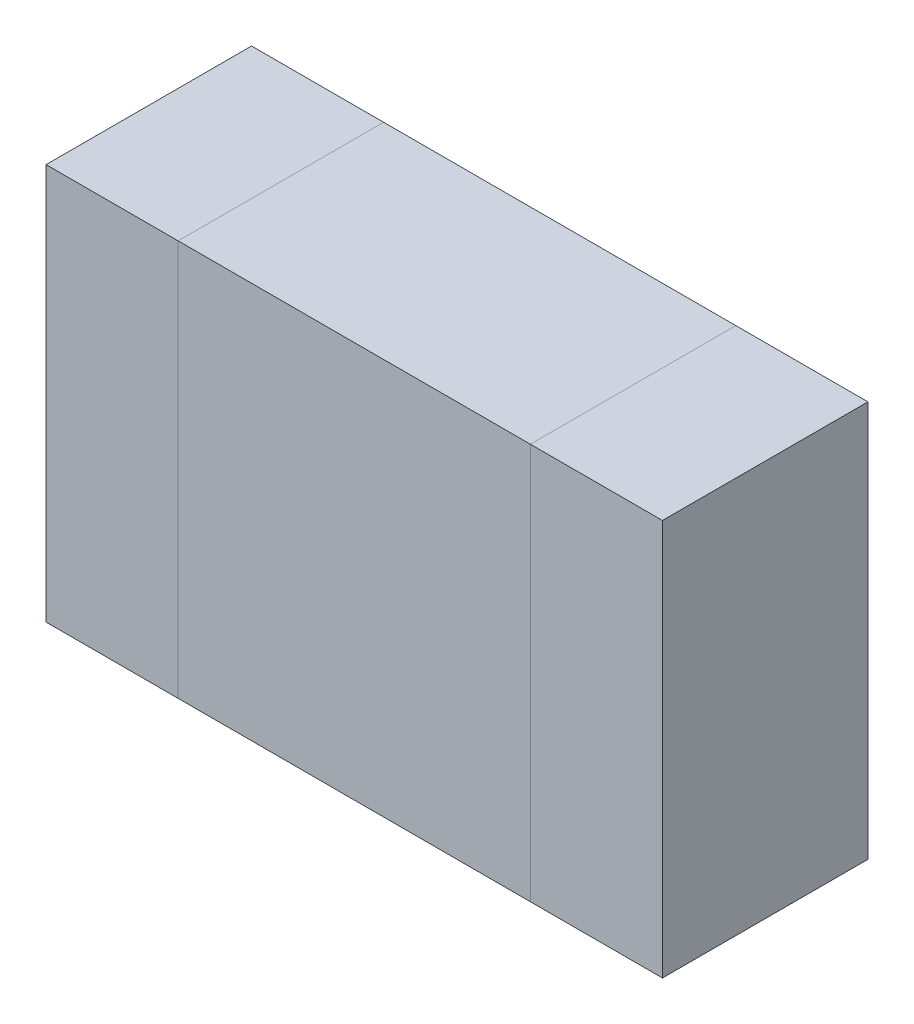
ISO-10303-21;
HEADER;
FILE_DESCRIPTION(('STEP AP214'),'2;1');
FILE_NAME('part.step','',(''),(''),'','','');
FILE_SCHEMA(('AUTOMOTIVE_DESIGN { 1 0 10303 214 1 1 1 1 }'));
ENDSEC;
DATA;
#1=APPLICATION_CONTEXT('core data for automotive mechanical design processes');
#2=APPLICATION_PROTOCOL_DEFINITION('international standard','automotive_design',2000,#1);
#3=PRODUCT_CONTEXT('',#1,'mechanical');
#4=PRODUCT('Part','Part','',(#3));
#5=PRODUCT_RELATED_PRODUCT_CATEGORY('part','',(#4));
#6=PRODUCT_DEFINITION_FORMATION('','',#4);
#7=PRODUCT_DEFINITION_CONTEXT('part definition',#1,'design');
#8=PRODUCT_DEFINITION('design','',#6,#7);
#9=PRODUCT_DEFINITION_SHAPE('','',#8);
#10=(LENGTH_UNIT() NAMED_UNIT(*) SI_UNIT(.MILLI.,.METRE.));
#11=(NAMED_UNIT(*) PLANE_ANGLE_UNIT() SI_UNIT($,.RADIAN.));
#12=(NAMED_UNIT(*) SI_UNIT($,.STERADIAN.) SOLID_ANGLE_UNIT());
#13=UNCERTAINTY_MEASURE_WITH_UNIT(LENGTH_MEASURE(1.E-05),#10,'distance_accuracy_value','');
#14=(GEOMETRIC_REPRESENTATION_CONTEXT(3) GLOBAL_UNCERTAINTY_ASSIGNED_CONTEXT((#13)) GLOBAL_UNIT_ASSIGNED_CONTEXT((#10,
#11,#12)) REPRESENTATION_CONTEXT('',''));
#15=CARTESIAN_POINT('',(0.,0.,0.));
#16=DIRECTION('',(0.,0.,1.));
#17=DIRECTION('',(1.,0.,0.));
#18=AXIS2_PLACEMENT_3D('',#15,#16,#17);
#19=CARTESIAN_POINT('',(-0.60000214508549,-0.67500589413531,-2.30000293254852));
#20=DIRECTION('',(0.999999999999987,1.6292067073209E-07,0.));
#21=DIRECTION('',(-1.6292067073209E-07,0.999999999999987,0.));
#22=AXIS2_PLACEMENT_3D('',#19,#20,#21);
#23=PLANE('',#22);
#24=DIRECTION('',(0.,1.,0.));
#25=VECTOR('',#24,1.);
#26=CARTESIAN_POINT('',(-0.600002145085491,-11.4999990463257,-1.6000018119812));
#27=LINE('',#26,#25);
#28=CARTESIAN_POINT('',(-0.60000214508549,-0.675005912463839,-1.6000018119812));
#29=VERTEX_POINT('',#28);
#30=CARTESIAN_POINT('',(-0.600002255057207,0.674997348357365,-1.6000018119812));
#31=VERTEX_POINT('',#30);
#32=EDGE_CURVE('P0_E68',#29,#31,#27,.T.);
#33=ORIENTED_EDGE('',*,*,#32,.F.);
#34=DIRECTION('',(0.,0.,1.));
#35=VECTOR('',#34,1.);
#36=CARTESIAN_POINT('',(-0.60000214508549,-0.675005894135311,-2.30000293254852));
#37=LINE('',#36,#35);
#38=CARTESIAN_POINT('',(-0.600002145085491,-0.675005930792368,-2.30000293254852));
#39=VERTEX_POINT('',#38);
#40=EDGE_CURVE('P0_E55',#39,#29,#37,.T.);
#41=ORIENTED_EDGE('',*,*,#40,.F.);
#42=DIRECTION('',(0.,1.,0.));
#43=VECTOR('',#42,1.);
#44=CARTESIAN_POINT('',(-0.600002145085491,-11.4999990463257,-2.30000293254852));
#45=LINE('',#44,#43);
#46=CARTESIAN_POINT('',(-0.600002255057207,0.674997348357365,-2.30000293254852));
#47=VERTEX_POINT('',#46);
#48=EDGE_CURVE('P0_E20',#39,#47,#45,.T.);
#49=ORIENTED_EDGE('',*,*,#48,.T.);
#50=DIRECTION('',(0.,0.,1.));
#51=VECTOR('',#50,1.);
#52=CARTESIAN_POINT('',(-0.600002365028924,0.674997348357365,-2.30000293254852));
#53=LINE('',#52,#51);
#54=EDGE_CURVE('P0_E81',#31,#47,#53,.F.);
#55=ORIENTED_EDGE('',*,*,#54,.F.);
#56=EDGE_LOOP('',(#33,#41,#49,#55));
#57=FACE_BOUND('',#56,.T.);
#58=ADVANCED_FACE('P0_F17',(#57),#23,.T.);
#59=CARTESIAN_POINT('',(22.7000007629395,-11.4999990463257,-2.30000293254852));
#60=DIRECTION('',(0.,0.,1.));
#61=DIRECTION('',(1.,0.,0.));
#62=AXIS2_PLACEMENT_3D('',#59,#60,#61);
#63=PLANE('',#62);
#64=DIRECTION('',(-0.999999999999987,-1.6292067073209E-07,0.));
#65=VECTOR('',#64,1.);
#66=CARTESIAN_POINT('',(-0.600002365028924,0.674997348357365,-2.30000293254852));
#67=LINE('',#66,#65);
#68=CARTESIAN_POINT('',(-1.05000122061974,0.674997311700308,-2.30000293254852));
#69=VERTEX_POINT('',#68);
#70=EDGE_CURVE('P0_E64',#47,#69,#67,.T.);
#71=ORIENTED_EDGE('',*,*,#70,.F.);
#72=ORIENTED_EDGE('',*,*,#48,.F.);
#73=DIRECTION('',(0.999999999999987,1.6292067073209E-07,0.));
#74=VECTOR('',#73,1.);
#75=CARTESIAN_POINT('',(-1.05000100067631,-0.675005967449426,-2.30000293254852));
#76=LINE('',#75,#74);
#77=CARTESIAN_POINT('',(-1.05000111064802,-0.675005967449426,-2.30000293254852));
#78=VERTEX_POINT('',#77);
#79=EDGE_CURVE('P0_E61',#78,#39,#76,.T.);
#80=ORIENTED_EDGE('',*,*,#79,.F.);
#81=DIRECTION('',(1.6292067073209E-07,-0.999999999999987,0.));
#82=VECTOR('',#81,1.);
#83=CARTESIAN_POINT('',(-1.05000122061974,0.67499727504325,-2.30000293254852));
#84=LINE('',#83,#82);
#85=EDGE_CURVE('P0_E83',#69,#78,#84,.T.);
#86=ORIENTED_EDGE('',*,*,#85,.F.);
#87=EDGE_LOOP('',(#71,#72,#80,#86));
#88=FACE_BOUND('',#87,.T.);
#89=ADVANCED_FACE('P0_F60',(#88),#63,.F.);
#90=CARTESIAN_POINT('',(-1.05000100067631,-0.675005967449426,-2.30000293254852));
#91=DIRECTION('',(1.6292067073209E-07,-0.999999999999987,0.));
#92=DIRECTION('',(0.999999999999987,1.6292067073209E-07,0.));
#93=AXIS2_PLACEMENT_3D('',#90,#91,#92);
#94=PLANE('',#93);
#95=DIRECTION('',(1.,0.,0.));
#96=VECTOR('',#95,1.);
#97=CARTESIAN_POINT('',(22.7000007629395,-0.675005967449426,-1.6000018119812));
#98=LINE('',#97,#96);
#99=CARTESIAN_POINT('',(-1.05000105566217,-0.675005967449426,-1.6000018119812));
#100=VERTEX_POINT('',#99);
#101=EDGE_CURVE('P0_E70',#100,#29,#98,.T.);
#102=ORIENTED_EDGE('',*,*,#101,.F.);
#103=DIRECTION('',(0.,0.,1.));
#104=VECTOR('',#103,1.);
#105=CARTESIAN_POINT('',(-1.05000100067631,-0.675005967449426,-2.30000293254852));
#106=LINE('',#105,#104);
#107=EDGE_CURVE('P0_E74',#78,#100,#106,.T.);
#108=ORIENTED_EDGE('',*,*,#107,.F.);
#109=ORIENTED_EDGE('',*,*,#79,.T.);
#110=ORIENTED_EDGE('',*,*,#40,.T.);
#111=EDGE_LOOP('',(#102,#108,#109,#110));
#112=FACE_BOUND('',#111,.T.);
#113=ADVANCED_FACE('P0_F72',(#112),#94,.T.);
#114=CARTESIAN_POINT('',(22.7000007629395,-11.4999990463257,-1.6000018119812));
#115=DIRECTION('',(0.,0.,1.));
#116=DIRECTION('',(1.,0.,0.));
#117=AXIS2_PLACEMENT_3D('',#114,#115,#116);
#118=PLANE('',#117);
#119=DIRECTION('',(-0.999999999999987,-1.6292067073209E-07,0.));
#120=VECTOR('',#119,1.);
#121=CARTESIAN_POINT('',(-0.600002365028924,0.674997348357365,-1.6000018119812));
#122=LINE('',#121,#120);
#123=CARTESIAN_POINT('',(-1.05000122061974,0.674997311700308,-1.6000018119812));
#124=VERTEX_POINT('',#123);
#125=EDGE_CURVE('P0_E35',#124,#31,#122,.F.);
#126=ORIENTED_EDGE('',*,*,#125,.F.);
#127=DIRECTION('',(1.6292067073209E-07,-0.999999999999987,0.));
#128=VECTOR('',#127,1.);
#129=CARTESIAN_POINT('',(-1.05000122061974,0.67499727504325,-1.6000018119812));
#130=LINE('',#129,#128);
#131=EDGE_CURVE('P0_E26',#100,#124,#130,.F.);
#132=ORIENTED_EDGE('',*,*,#131,.F.);
#133=ORIENTED_EDGE('',*,*,#101,.T.);
#134=ORIENTED_EDGE('',*,*,#32,.T.);
#135=EDGE_LOOP('',(#126,#132,#133,#134));
#136=FACE_BOUND('',#135,.T.);
#137=ADVANCED_FACE('P0_F89',(#136),#118,.T.);
#138=CARTESIAN_POINT('',(-0.600002365028924,0.674997348357365,-2.30000293254852));
#139=DIRECTION('',(-1.6292067073209E-07,0.999999999999987,0.));
#140=DIRECTION('',(-0.999999999999987,-1.6292067073209E-07,0.));
#141=AXIS2_PLACEMENT_3D('',#138,#139,#140);
#142=PLANE('',#141);
#143=ORIENTED_EDGE('',*,*,#125,.T.);
#144=ORIENTED_EDGE('',*,*,#54,.T.);
#145=ORIENTED_EDGE('',*,*,#70,.T.);
#146=DIRECTION('',(0.,0.,1.));
#147=VECTOR('',#146,1.);
#148=CARTESIAN_POINT('',(-1.05000122061974,0.67499727504325,-2.30000293254852));
#149=LINE('',#148,#147);
#150=EDGE_CURVE('P0_E11',#124,#69,#149,.F.);
#151=ORIENTED_EDGE('',*,*,#150,.F.);
#152=EDGE_LOOP('',(#143,#144,#145,#151));
#153=FACE_BOUND('',#152,.T.);
#154=ADVANCED_FACE('P0_F91',(#153),#142,.T.);
#155=CARTESIAN_POINT('',(-1.05000122061974,0.67499727504325,-2.30000293254852));
#156=DIRECTION('',(-0.999999999999987,-1.6292067073209E-07,0.));
#157=DIRECTION('',(1.6292067073209E-07,-0.999999999999987,0.));
#158=AXIS2_PLACEMENT_3D('',#155,#156,#157);
#159=PLANE('',#158);
#160=ORIENTED_EDGE('',*,*,#131,.T.);
#161=ORIENTED_EDGE('',*,*,#150,.T.);
#162=ORIENTED_EDGE('',*,*,#85,.T.);
#163=ORIENTED_EDGE('',*,*,#107,.T.);
#164=EDGE_LOOP('',(#160,#161,#162,#163));
#165=FACE_BOUND('',#164,.T.);
#166=ADVANCED_FACE('P0_F88',(#165),#159,.T.);
#167=CLOSED_SHELL('',(#58,#89,#113,#137,#154,#166));
#168=MANIFOLD_SOLID_BREP('P0_B1',#167);
#169=CARTESIAN_POINT('',(0.599996490561896,0.674997543861984,-2.30000293254852));
#170=DIRECTION('',(-0.999999999999987,-1.6292067073209E-07,0.));
#171=DIRECTION('',(1.6292067073209E-07,-0.999999999999987,0.));
#172=AXIS2_PLACEMENT_3D('',#169,#170,#171);
#173=PLANE('',#172);
#174=DIRECTION('',(0.,1.,0.));
#175=VECTOR('',#174,1.);
#176=CARTESIAN_POINT('',(0.599996490561895,-11.4999990463257,-1.6000018119812));
#177=LINE('',#176,#175);
#178=CARTESIAN_POINT('',(0.599996490561896,0.67499756219059,-1.6000018119812));
#179=VERTEX_POINT('',#178);
#180=CARTESIAN_POINT('',(0.599996600533612,-0.675005698630692,-1.6000018119812));
#181=VERTEX_POINT('',#180);
#182=EDGE_CURVE('P1_E68',#179,#181,#177,.F.);
#183=ORIENTED_EDGE('',*,*,#182,.F.);
#184=DIRECTION('',(0.,0.,1.));
#185=VECTOR('',#184,1.);
#186=CARTESIAN_POINT('',(0.599996490561896,0.674997543861983,-2.30000293254852));
#187=LINE('',#186,#185);
#188=CARTESIAN_POINT('',(0.599996490561896,0.674997580519196,-2.30000293254852));
#189=VERTEX_POINT('',#188);
#190=EDGE_CURVE('P1_E55',#189,#179,#187,.T.);
#191=ORIENTED_EDGE('',*,*,#190,.F.);
#192=DIRECTION('',(0.,1.,0.));
#193=VECTOR('',#192,1.);
#194=CARTESIAN_POINT('',(0.599996490561895,-11.4999990463257,-2.30000293254852));
#195=LINE('',#194,#193);
#196=CARTESIAN_POINT('',(0.599996600533612,-0.675005698630692,-2.30000293254852));
#197=VERTEX_POINT('',#196);
#198=EDGE_CURVE('P1_E20',#189,#197,#195,.F.);
#199=ORIENTED_EDGE('',*,*,#198,.T.);
#200=DIRECTION('',(0.,0.,1.));
#201=VECTOR('',#200,1.);
#202=CARTESIAN_POINT('',(0.59999671050533,-0.675005698630692,-2.30000293254852));
#203=LINE('',#202,#201);
#204=EDGE_CURVE('P1_E81',#181,#197,#203,.F.);
#205=ORIENTED_EDGE('',*,*,#204,.F.);
#206=EDGE_LOOP('',(#183,#191,#199,#205));
#207=FACE_BOUND('',#206,.T.);
#208=ADVANCED_FACE('P1_F17',(#207),#173,.T.);
#209=CARTESIAN_POINT('',(22.7000007629395,-11.4999990463257,-2.30000293254852));
#210=DIRECTION('',(0.,0.,1.));
#211=DIRECTION('',(1.,0.,0.));
#212=AXIS2_PLACEMENT_3D('',#209,#210,#211);
#213=PLANE('',#212);
#214=DIRECTION('',(-0.999999999999987,-1.6292067073209E-07,0.));
#215=VECTOR('',#214,1.);
#216=CARTESIAN_POINT('',(1.04999725350135,0.674997617176409,-2.30000293254852));
#217=LINE('',#216,#215);
#218=CARTESIAN_POINT('',(1.04999736347306,0.674997617176409,-2.30000293254852));
#219=VERTEX_POINT('',#218);
#220=EDGE_CURVE('P1_E61',#219,#189,#217,.T.);
#221=ORIENTED_EDGE('',*,*,#220,.F.);
#222=DIRECTION('',(-1.6292067073209E-07,0.999999999999987,0.));
#223=VECTOR('',#222,1.);
#224=CARTESIAN_POINT('',(1.04999747344478,-0.675005625316267,-2.30000293254852));
#225=LINE('',#224,#223);
#226=CARTESIAN_POINT('',(1.04999747344478,-0.67500566197348,-2.30000293254852));
#227=VERTEX_POINT('',#226);
#228=EDGE_CURVE('P1_E83',#227,#219,#225,.T.);
#229=ORIENTED_EDGE('',*,*,#228,.F.);
#230=DIRECTION('',(0.999999999999987,1.6292067073209E-07,0.));
#231=VECTOR('',#230,1.);
#232=CARTESIAN_POINT('',(0.59999671050533,-0.675005698630692,-2.30000293254852));
#233=LINE('',#232,#231);
#234=EDGE_CURVE('P1_E64',#197,#227,#233,.T.);
#235=ORIENTED_EDGE('',*,*,#234,.F.);
#236=ORIENTED_EDGE('',*,*,#198,.F.);
#237=EDGE_LOOP('',(#221,#229,#235,#236));
#238=FACE_BOUND('',#237,.T.);
#239=ADVANCED_FACE('P1_F60',(#238),#213,.F.);
#240=CARTESIAN_POINT('',(1.04999725350135,0.674997617176409,-2.30000293254852));
#241=DIRECTION('',(-1.6292067073209E-07,0.999999999999987,0.));
#242=DIRECTION('',(-0.999999999999987,-1.6292067073209E-07,0.));
#243=AXIS2_PLACEMENT_3D('',#240,#241,#242);
#244=PLANE('',#243);
#245=DIRECTION('',(1.,0.,0.));
#246=VECTOR('',#245,1.);
#247=CARTESIAN_POINT('',(22.7000007629395,0.674997617176409,-1.6000018119812));
#248=LINE('',#247,#246);
#249=CARTESIAN_POINT('',(1.04999730848721,0.674997617176409,-1.6000018119812));
#250=VERTEX_POINT('',#249);
#251=EDGE_CURVE('P1_E70',#250,#179,#248,.F.);
#252=ORIENTED_EDGE('',*,*,#251,.F.);
#253=DIRECTION('',(0.,0.,1.));
#254=VECTOR('',#253,1.);
#255=CARTESIAN_POINT('',(1.04999725350135,0.674997617176409,-2.30000293254852));
#256=LINE('',#255,#254);
#257=EDGE_CURVE('P1_E74',#219,#250,#256,.T.);
#258=ORIENTED_EDGE('',*,*,#257,.F.);
#259=ORIENTED_EDGE('',*,*,#220,.T.);
#260=ORIENTED_EDGE('',*,*,#190,.T.);
#261=EDGE_LOOP('',(#252,#258,#259,#260));
#262=FACE_BOUND('',#261,.T.);
#263=ADVANCED_FACE('P1_F72',(#262),#244,.T.);
#264=CARTESIAN_POINT('',(22.7000007629395,-11.4999990463257,-1.6000018119812));
#265=DIRECTION('',(0.,0.,1.));
#266=DIRECTION('',(1.,0.,0.));
#267=AXIS2_PLACEMENT_3D('',#264,#265,#266);
#268=PLANE('',#267);
#269=ORIENTED_EDGE('',*,*,#251,.T.);
#270=ORIENTED_EDGE('',*,*,#182,.T.);
#271=DIRECTION('',(0.999999999999987,1.6292067073209E-07,0.));
#272=VECTOR('',#271,1.);
#273=CARTESIAN_POINT('',(0.59999671050533,-0.675005698630692,-1.6000018119812));
#274=LINE('',#273,#272);
#275=CARTESIAN_POINT('',(1.04999747344478,-0.67500566197348,-1.6000018119812));
#276=VERTEX_POINT('',#275);
#277=EDGE_CURVE('P1_E35',#276,#181,#274,.F.);
#278=ORIENTED_EDGE('',*,*,#277,.F.);
#279=DIRECTION('',(-1.6292067073209E-07,0.999999999999987,0.));
#280=VECTOR('',#279,1.);
#281=CARTESIAN_POINT('',(1.04999747344478,-0.675005625316267,-1.6000018119812));
#282=LINE('',#281,#280);
#283=EDGE_CURVE('P1_E26',#250,#276,#282,.F.);
#284=ORIENTED_EDGE('',*,*,#283,.F.);
#285=EDGE_LOOP('',(#269,#270,#278,#284));
#286=FACE_BOUND('',#285,.T.);
#287=ADVANCED_FACE('P1_F89',(#286),#268,.T.);
#288=CARTESIAN_POINT('',(0.59999671050533,-0.675005698630692,-2.30000293254852));
#289=DIRECTION('',(1.6292067073209E-07,-0.999999999999987,0.));
#290=DIRECTION('',(0.999999999999987,1.6292067073209E-07,0.));
#291=AXIS2_PLACEMENT_3D('',#288,#289,#290);
#292=PLANE('',#291);
#293=ORIENTED_EDGE('',*,*,#277,.T.);
#294=ORIENTED_EDGE('',*,*,#204,.T.);
#295=ORIENTED_EDGE('',*,*,#234,.T.);
#296=DIRECTION('',(0.,0.,1.));
#297=VECTOR('',#296,1.);
#298=CARTESIAN_POINT('',(1.04999747344478,-0.675005625316267,-2.30000293254852));
#299=LINE('',#298,#297);
#300=EDGE_CURVE('P1_E11',#276,#227,#299,.F.);
#301=ORIENTED_EDGE('',*,*,#300,.F.);
#302=EDGE_LOOP('',(#293,#294,#295,#301));
#303=FACE_BOUND('',#302,.T.);
#304=ADVANCED_FACE('P1_F91',(#303),#292,.T.);
#305=CARTESIAN_POINT('',(1.04999747344478,-0.675005625316267,-2.30000293254852));
#306=DIRECTION('',(0.999999999999987,1.6292067073209E-07,0.));
#307=DIRECTION('',(-1.6292067073209E-07,0.999999999999987,0.));
#308=AXIS2_PLACEMENT_3D('',#305,#306,#307);
#309=PLANE('',#308);
#310=ORIENTED_EDGE('',*,*,#283,.T.);
#311=ORIENTED_EDGE('',*,*,#300,.T.);
#312=ORIENTED_EDGE('',*,*,#228,.T.);
#313=ORIENTED_EDGE('',*,*,#257,.T.);
#314=EDGE_LOOP('',(#310,#311,#312,#313));
#315=FACE_BOUND('',#314,.T.);
#316=ADVANCED_FACE('P1_F88',(#315),#309,.T.);
#317=CLOSED_SHELL('',(#208,#239,#263,#287,#304,#316));
#318=MANIFOLD_SOLID_BREP('P1_B1',#317);
#319=CARTESIAN_POINT('',(22.7000007629395,-11.4999990463257,-2.30000293254852));
#320=DIRECTION('',(0.,0.,1.));
#321=DIRECTION('',(1.,0.,0.));
#322=AXIS2_PLACEMENT_3D('',#319,#320,#321);
#323=PLANE('',#322);
#324=DIRECTION('',(-0.999999999999987,-1.6292067073209E-07,0.));
#325=VECTOR('',#324,1.);
#326=CARTESIAN_POINT('',(0.599996490561896,0.674997543861984,-2.30000293254852));
#327=LINE('',#326,#325);
#328=CARTESIAN_POINT('',(0.599996600533613,0.674997543861984,-2.30000293254852));
#329=VERTEX_POINT('',#328);
#330=CARTESIAN_POINT('',(-0.600002365028923,0.674997446109674,-2.30000293254852));
#331=VERTEX_POINT('',#330);
#332=EDGE_CURVE('P2_E55',#329,#331,#327,.T.);
#333=ORIENTED_EDGE('',*,*,#332,.F.);
#334=DIRECTION('',(-1.6292067073209E-07,0.999999999999987,0.));
#335=VECTOR('',#334,1.);
#336=CARTESIAN_POINT('',(0.59999671050533,-0.675005698630692,-2.30000293254852));
#337=LINE('',#336,#335);
#338=CARTESIAN_POINT('',(0.59999671050533,-0.675005796383001,-2.30000293254852));
#339=VERTEX_POINT('',#338);
#340=EDGE_CURVE('P2_E57',#339,#329,#337,.T.);
#341=ORIENTED_EDGE('',*,*,#340,.F.);
#342=DIRECTION('',(0.999999999999987,1.6292067073209E-07,0.));
#343=VECTOR('',#342,1.);
#344=CARTESIAN_POINT('',(-0.60000214508549,-0.67500589413531,-2.30000293254852));
#345=LINE('',#344,#343);
#346=CARTESIAN_POINT('',(-0.600002255057206,-0.67500589413531,-2.30000293254852));
#347=VERTEX_POINT('',#346);
#348=EDGE_CURVE('P2_E20',#347,#339,#345,.T.);
#349=ORIENTED_EDGE('',*,*,#348,.F.);
#350=DIRECTION('',(1.6292067073209E-07,-0.999999999999987,0.));
#351=VECTOR('',#350,1.);
#352=CARTESIAN_POINT('',(-0.600002365028924,0.674997348357365,-2.30000293254852));
#353=LINE('',#352,#351);
#354=EDGE_CURVE('P2_E79',#331,#347,#353,.T.);
#355=ORIENTED_EDGE('',*,*,#354,.F.);
#356=EDGE_LOOP('',(#333,#341,#349,#355));
#357=FACE_BOUND('',#356,.T.);
#358=ADVANCED_FACE('P2_F17',(#357),#323,.F.);
#359=CARTESIAN_POINT('',(-0.60000214508549,-0.67500589413531,-2.30000293254852));
#360=DIRECTION('',(1.6292067073209E-07,-0.999999999999987,0.));
#361=DIRECTION('',(0.999999999999987,1.6292067073209E-07,0.));
#362=AXIS2_PLACEMENT_3D('',#359,#360,#361);
#363=PLANE('',#362);
#364=DIRECTION('',(1.,0.,0.));
#365=VECTOR('',#364,1.);
#366=CARTESIAN_POINT('',(22.7000007629395,-0.67500589413531,-1.6000018119812));
#367=LINE('',#366,#365);
#368=CARTESIAN_POINT('',(-0.600002200071348,-0.67500589413531,-1.6000018119812));
#369=VERTEX_POINT('',#368);
#370=CARTESIAN_POINT('',(0.59999671050533,-0.675005747506846,-1.6000018119812));
#371=VERTEX_POINT('',#370);
#372=EDGE_CURVE('P2_E83',#369,#371,#367,.T.);
#373=ORIENTED_EDGE('',*,*,#372,.F.);
#374=DIRECTION('',(0.,0.,1.));
#375=VECTOR('',#374,1.);
#376=CARTESIAN_POINT('',(-0.60000214508549,-0.67500589413531,-2.30000293254852));
#377=LINE('',#376,#375);
#378=EDGE_CURVE('P2_E68',#347,#369,#377,.T.);
#379=ORIENTED_EDGE('',*,*,#378,.F.);
#380=ORIENTED_EDGE('',*,*,#348,.T.);
#381=DIRECTION('',(0.,0.,1.));
#382=VECTOR('',#381,1.);
#383=CARTESIAN_POINT('',(0.59999671050533,-0.675005698630692,-2.30000293254852));
#384=LINE('',#383,#382);
#385=EDGE_CURVE('P2_E63',#371,#339,#384,.F.);
#386=ORIENTED_EDGE('',*,*,#385,.F.);
#387=EDGE_LOOP('',(#373,#379,#380,#386));
#388=FACE_BOUND('',#387,.T.);
#389=ADVANCED_FACE('P2_F65',(#388),#363,.T.);
#390=CARTESIAN_POINT('',(0.59999671050533,-0.675005698630692,-2.30000293254852));
#391=DIRECTION('',(0.999999999999987,1.6292067073209E-07,0.));
#392=DIRECTION('',(-1.6292067073209E-07,0.999999999999987,0.));
#393=AXIS2_PLACEMENT_3D('',#390,#391,#392);
#394=PLANE('',#393);
#395=DIRECTION('',(0.,1.,0.));
#396=VECTOR('',#395,1.);
#397=CARTESIAN_POINT('',(0.59999671050533,-11.4999990463257,-1.6000018119812));
#398=LINE('',#397,#396);
#399=CARTESIAN_POINT('',(0.599996545547755,0.674997543861984,-1.6000018119812));
#400=VERTEX_POINT('',#399);
#401=EDGE_CURVE('P2_E72',#371,#400,#398,.T.);
#402=ORIENTED_EDGE('',*,*,#401,.F.);
#403=ORIENTED_EDGE('',*,*,#385,.T.);
#404=ORIENTED_EDGE('',*,*,#340,.T.);
#405=DIRECTION('',(0.,0.,1.));
#406=VECTOR('',#405,1.);
#407=CARTESIAN_POINT('',(0.599996490561896,0.674997543861984,-2.30000293254852));
#408=LINE('',#407,#406);
#409=EDGE_CURVE('P2_E75',#400,#329,#408,.F.);
#410=ORIENTED_EDGE('',*,*,#409,.F.);
#411=EDGE_LOOP('',(#402,#403,#404,#410));
#412=FACE_BOUND('',#411,.T.);
#413=ADVANCED_FACE('P2_F70',(#412),#394,.T.);
#414=CARTESIAN_POINT('',(0.599996490561896,0.674997543861984,-2.30000293254852));
#415=DIRECTION('',(-1.6292067073209E-07,0.999999999999987,0.));
#416=DIRECTION('',(-0.999999999999987,-1.6292067073209E-07,0.));
#417=AXIS2_PLACEMENT_3D('',#414,#415,#416);
#418=PLANE('',#417);
#419=DIRECTION('',(1.,0.,0.));
#420=VECTOR('',#419,1.);
#421=CARTESIAN_POINT('',(22.7000007629395,0.674997543861983,-1.6000018119812));
#422=LINE('',#421,#420);
#423=CARTESIAN_POINT('',(-0.600002365028924,0.67499739723352,-1.6000018119812));
#424=VERTEX_POINT('',#423);
#425=EDGE_CURVE('P2_E26',#400,#424,#422,.F.);
#426=ORIENTED_EDGE('',*,*,#425,.F.);
#427=ORIENTED_EDGE('',*,*,#409,.T.);
#428=ORIENTED_EDGE('',*,*,#332,.T.);
#429=DIRECTION('',(0.,0.,1.));
#430=VECTOR('',#429,1.);
#431=CARTESIAN_POINT('',(-0.600002365028924,0.674997348357365,-2.30000293254852));
#432=LINE('',#431,#430);
#433=EDGE_CURVE('P2_E35',#424,#331,#432,.F.);
#434=ORIENTED_EDGE('',*,*,#433,.F.);
#435=EDGE_LOOP('',(#426,#427,#428,#434));
#436=FACE_BOUND('',#435,.T.);
#437=ADVANCED_FACE('P2_F89',(#436),#418,.T.);
#438=CARTESIAN_POINT('',(-0.600002365028924,0.674997348357365,-2.30000293254852));
#439=DIRECTION('',(-0.999999999999987,-1.6292067073209E-07,0.));
#440=DIRECTION('',(1.6292067073209E-07,-0.999999999999987,0.));
#441=AXIS2_PLACEMENT_3D('',#438,#439,#440);
#442=PLANE('',#441);
#443=DIRECTION('',(0.,1.,0.));
#444=VECTOR('',#443,1.);
#445=CARTESIAN_POINT('',(-0.600002365028923,-11.4999990463257,-1.6000018119812));
#446=LINE('',#445,#444);
#447=EDGE_CURVE('P2_E11',#424,#369,#446,.F.);
#448=ORIENTED_EDGE('',*,*,#447,.F.);
#449=ORIENTED_EDGE('',*,*,#433,.T.);
#450=ORIENTED_EDGE('',*,*,#354,.T.);
#451=ORIENTED_EDGE('',*,*,#378,.T.);
#452=EDGE_LOOP('',(#448,#449,#450,#451));
#453=FACE_BOUND('',#452,.T.);
#454=ADVANCED_FACE('P2_F91',(#453),#442,.T.);
#455=CARTESIAN_POINT('',(22.7000007629395,-11.4999990463257,-1.6000018119812));
#456=DIRECTION('',(0.,0.,1.));
#457=DIRECTION('',(1.,0.,0.));
#458=AXIS2_PLACEMENT_3D('',#455,#456,#457);
#459=PLANE('',#458);
#460=ORIENTED_EDGE('',*,*,#425,.T.);
#461=ORIENTED_EDGE('',*,*,#447,.T.);
#462=ORIENTED_EDGE('',*,*,#372,.T.);
#463=ORIENTED_EDGE('',*,*,#401,.T.);
#464=EDGE_LOOP('',(#460,#461,#462,#463));
#465=FACE_BOUND('',#464,.T.);
#466=ADVANCED_FACE('P2_F88',(#465),#459,.T.);
#467=CLOSED_SHELL('',(#358,#389,#413,#437,#454,#466));
#468=MANIFOLD_SOLID_BREP('P2_B1',#467);
#469=ADVANCED_BREP_SHAPE_REPRESENTATION('',(#18,#168,#318,#468),#14);
#470=SHAPE_DEFINITION_REPRESENTATION(#9,#469);
ENDSEC;
END-ISO-10303-21;
